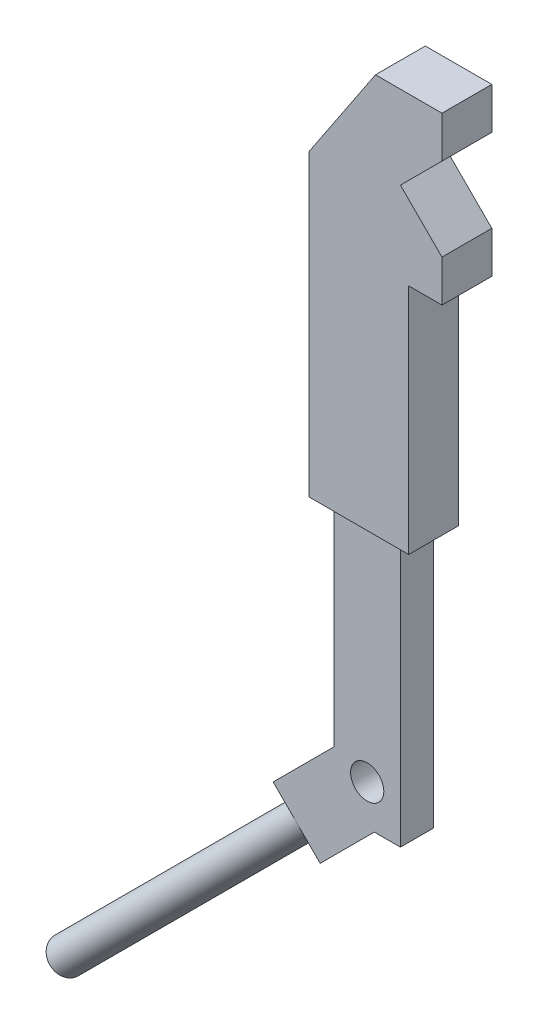
ISO-10303-21;
HEADER;
FILE_DESCRIPTION(('STEP AP214'),'2;1');
FILE_NAME('part.step','',(''),(''),'','','');
FILE_SCHEMA(('AUTOMOTIVE_DESIGN { 1 0 10303 214 1 1 1 1 }'));
ENDSEC;
DATA;
#1=APPLICATION_CONTEXT('core data for automotive mechanical design processes');
#2=APPLICATION_PROTOCOL_DEFINITION('international standard','automotive_design',2000,#1);
#3=PRODUCT_CONTEXT('',#1,'mechanical');
#4=PRODUCT('Part','Part','',(#3));
#5=PRODUCT_RELATED_PRODUCT_CATEGORY('part','',(#4));
#6=PRODUCT_DEFINITION_FORMATION('','',#4);
#7=PRODUCT_DEFINITION_CONTEXT('part definition',#1,'design');
#8=PRODUCT_DEFINITION('design','',#6,#7);
#9=PRODUCT_DEFINITION_SHAPE('','',#8);
#10=(LENGTH_UNIT() NAMED_UNIT(*) SI_UNIT(.MILLI.,.METRE.));
#11=(NAMED_UNIT(*) PLANE_ANGLE_UNIT() SI_UNIT($,.RADIAN.));
#12=(NAMED_UNIT(*) SI_UNIT($,.STERADIAN.) SOLID_ANGLE_UNIT());
#13=UNCERTAINTY_MEASURE_WITH_UNIT(LENGTH_MEASURE(1.E-05),#10,'distance_accuracy_value','');
#14=(GEOMETRIC_REPRESENTATION_CONTEXT(3) GLOBAL_UNCERTAINTY_ASSIGNED_CONTEXT((#13)) GLOBAL_UNIT_ASSIGNED_CONTEXT((#10,
#11,#12)) REPRESENTATION_CONTEXT('',''));
#15=CARTESIAN_POINT('',(0.,0.,0.));
#16=DIRECTION('',(0.,0.,1.));
#17=DIRECTION('',(1.,0.,0.));
#18=AXIS2_PLACEMENT_3D('',#15,#16,#17);
#19=CARTESIAN_POINT('',(-28.284271247462,-2.1421356237308,5.));
#20=DIRECTION('',(0.707106781186551,0.707106781186544,0.));
#21=DIRECTION('',(-0.707106781186544,0.707106781186551,0.));
#22=AXIS2_PLACEMENT_3D('',#19,#20,#21);
#23=PLANE('',#22);
#24=CARTESIAN_POINT('',(-21.2132034355965,-9.21320343559631,0.));
#25=DIRECTION('',(-0.707106781186551,-0.707106781186544,0.));
#26=DIRECTION('',(0.707106781186544,-0.707106781186551,0.));
#27=AXIS2_PLACEMENT_3D('',#24,#25,#26);
#28=CIRCLE('',#27,5.);
#29=CARTESIAN_POINT('',(-21.2132034355965,-9.21320343559631,5.));
#30=VERTEX_POINT('',#29);
#31=CARTESIAN_POINT('',(-21.2132034355965,-9.21320343559631,-5.));
#32=VERTEX_POINT('',#31);
#33=EDGE_CURVE('E43',#30,#32,#28,.T.);
#34=ORIENTED_EDGE('',*,*,#33,.F.);
#35=DIRECTION('',(0.707106781186544,-0.707106781186551,0.));
#36=VECTOR('',#35,1.);
#37=CARTESIAN_POINT('',(-28.284271247462,-2.1421356237308,5.));
#38=LINE('',#37,#36);
#39=CARTESIAN_POINT('',(-28.284271247462,-2.1421356237308,5.));
#40=VERTEX_POINT('',#39);
#41=EDGE_CURVE('E158',#40,#30,#38,.T.);
#42=ORIENTED_EDGE('',*,*,#41,.F.);
#43=DIRECTION('',(0.,0.,-1.));
#44=VECTOR('',#43,1.);
#45=CARTESIAN_POINT('',(-28.284271247462,-2.1421356237308,5.));
#46=LINE('',#45,#44);
#47=CARTESIAN_POINT('',(-28.284271247462,-2.1421356237308,-5.));
#48=VERTEX_POINT('',#47);
#49=EDGE_CURVE('E291',#40,#48,#46,.T.);
#50=ORIENTED_EDGE('',*,*,#49,.T.);
#51=DIRECTION('',(0.707106781186544,-0.707106781186551,0.));
#52=VECTOR('',#51,1.);
#53=CARTESIAN_POINT('',(-28.284271247462,-2.1421356237308,-5.));
#54=LINE('',#53,#52);
#55=EDGE_CURVE('E179',#48,#32,#54,.T.);
#56=ORIENTED_EDGE('',*,*,#55,.T.);
#57=EDGE_LOOP('',(#34,#42,#50,#56));
#58=FACE_BOUND('',#57,.T.);
#59=ADVANCED_FACE('F33',(#58),#23,.F.);
#60=CARTESIAN_POINT('',(-10.,0.,5.));
#61=DIRECTION('',(1.,0.,0.));
#62=DIRECTION('',(0.,0.,-1.));
#63=AXIS2_PLACEMENT_3D('',#60,#61,#62);
#64=PLANE('',#63);
#65=DIRECTION('',(0.,0.,-1.));
#66=VECTOR('',#65,1.);
#67=CARTESIAN_POINT('',(-10.,16.142135623731,5.));
#68=LINE('',#67,#66);
#69=CARTESIAN_POINT('',(-10.,16.142135623731,5.));
#70=VERTEX_POINT('',#69);
#71=CARTESIAN_POINT('',(-10.,16.142135623731,-5.));
#72=VERTEX_POINT('',#71);
#73=EDGE_CURVE('E37',#70,#72,#68,.T.);
#74=ORIENTED_EDGE('',*,*,#73,.F.);
#75=DIRECTION('',(0.,-1.,0.));
#76=VECTOR('',#75,1.);
#77=CARTESIAN_POINT('',(-10.,0.,5.));
#78=LINE('',#77,#76);
#79=CARTESIAN_POINT('',(-10.,80.,5.));
#80=VERTEX_POINT('',#79);
#81=EDGE_CURVE('E372',#80,#70,#78,.T.);
#82=ORIENTED_EDGE('',*,*,#81,.F.);
#83=DIRECTION('',(0.,0.,-1.));
#84=VECTOR('',#83,1.);
#85=CARTESIAN_POINT('',(-10.,80.,5.));
#86=LINE('',#85,#84);
#87=CARTESIAN_POINT('',(-10.,80.,-5.));
#88=VERTEX_POINT('',#87);
#89=EDGE_CURVE('E380',#80,#88,#86,.T.);
#90=ORIENTED_EDGE('',*,*,#89,.T.);
#91=DIRECTION('',(0.,-1.,0.));
#92=VECTOR('',#91,1.);
#93=CARTESIAN_POINT('',(-10.,0.,-5.));
#94=LINE('',#93,#92);
#95=EDGE_CURVE('E369',#88,#72,#94,.T.);
#96=ORIENTED_EDGE('',*,*,#95,.T.);
#97=EDGE_LOOP('',(#74,#82,#90,#96));
#98=FACE_BOUND('',#97,.T.);
#99=ADVANCED_FACE('F35',(#98),#64,.F.);
#100=CARTESIAN_POINT('',(-10.,0.,5.));
#101=DIRECTION('',(0.,1.,0.));
#102=DIRECTION('',(-1.,0.,0.));
#103=AXIS2_PLACEMENT_3D('',#100,#101,#102);
#104=PLANE('',#103);
#105=DIRECTION('',(0.,0.,1.));
#106=VECTOR('',#105,1.);
#107=CARTESIAN_POINT('',(2.1421356237309,0.,5.));
#108=LINE('',#107,#106);
#109=CARTESIAN_POINT('',(2.1421356237309,0.,-5.));
#110=VERTEX_POINT('',#109);
#111=CARTESIAN_POINT('',(2.1421356237309,0.,5.));
#112=VERTEX_POINT('',#111);
#113=EDGE_CURVE('E274',#110,#112,#108,.T.);
#114=ORIENTED_EDGE('',*,*,#113,.F.);
#115=DIRECTION('',(1.,0.,0.));
#116=VECTOR('',#115,1.);
#117=CARTESIAN_POINT('',(-10.,0.,-5.));
#118=LINE('',#117,#116);
#119=CARTESIAN_POINT('',(9.99999999999999,0.,-5.));
#120=VERTEX_POINT('',#119);
#121=EDGE_CURVE('E277',#110,#120,#118,.T.);
#122=ORIENTED_EDGE('',*,*,#121,.T.);
#123=DIRECTION('',(0.,0.,-1.));
#124=VECTOR('',#123,1.);
#125=CARTESIAN_POINT('',(9.99999999999999,0.,5.));
#126=LINE('',#125,#124);
#127=CARTESIAN_POINT('',(9.99999999999999,0.,5.));
#128=VERTEX_POINT('',#127);
#129=EDGE_CURVE('E281',#128,#120,#126,.T.);
#130=ORIENTED_EDGE('',*,*,#129,.F.);
#131=DIRECTION('',(1.,0.,0.));
#132=VECTOR('',#131,1.);
#133=CARTESIAN_POINT('',(-10.,0.,5.));
#134=LINE('',#133,#132);
#135=EDGE_CURVE('E279',#112,#128,#134,.T.);
#136=ORIENTED_EDGE('',*,*,#135,.F.);
#137=EDGE_LOOP('',(#114,#122,#130,#136));
#138=FACE_BOUND('',#137,.T.);
#139=ADVANCED_FACE('F201',(#138),#104,.F.);
#140=CARTESIAN_POINT('',(0.,0.,5.));
#141=DIRECTION('',(0.,0.,-1.));
#142=DIRECTION('',(-1.,0.,0.));
#143=AXIS2_PLACEMENT_3D('',#140,#141,#142);
#144=PLANE('',#143);
#145=ORIENTED_EDGE('',*,*,#81,.T.);
#146=DIRECTION('',(-0.707106781186551,-0.707106781186544,0.));
#147=VECTOR('',#146,1.);
#148=CARTESIAN_POINT('',(-7.07106781186544,19.0710678118655,5.));
#149=LINE('',#148,#147);
#150=EDGE_CURVE('E165',#70,#40,#149,.T.);
#151=ORIENTED_EDGE('',*,*,#150,.T.);
#152=ORIENTED_EDGE('',*,*,#41,.T.);
#153=CARTESIAN_POINT('',(-14.1421356237311,-16.2842712474618,5.));
#154=VERTEX_POINT('',#153);
#155=EDGE_CURVE('E162',#30,#154,#38,.T.);
#156=ORIENTED_EDGE('',*,*,#155,.T.);
#157=DIRECTION('',(0.707106781186551,0.707106781186544,0.));
#158=VECTOR('',#157,1.);
#159=CARTESIAN_POINT('',(7.07106781186544,4.92893218813449,5.));
#160=LINE('',#159,#158);
#161=EDGE_CURVE('E170',#154,#112,#160,.T.);
#162=ORIENTED_EDGE('',*,*,#161,.T.);
#163=ORIENTED_EDGE('',*,*,#135,.T.);
#164=DIRECTION('',(0.,1.,0.));
#165=VECTOR('',#164,1.);
#166=CARTESIAN_POINT('',(9.99999999999999,0.,5.));
#167=LINE('',#166,#165);
#168=CARTESIAN_POINT('',(10.,80.,5.));
#169=VERTEX_POINT('',#168);
#170=EDGE_CURVE('E376',#128,#169,#167,.T.);
#171=ORIENTED_EDGE('',*,*,#170,.T.);
#172=DIRECTION('',(-1.,0.,0.));
#173=VECTOR('',#172,1.);
#174=CARTESIAN_POINT('',(-10.,80.,5.));
#175=LINE('',#174,#173);
#176=EDGE_CURVE('E378',#169,#80,#175,.T.);
#177=ORIENTED_EDGE('',*,*,#176,.T.);
#178=EDGE_LOOP('',(#145,#151,#152,#156,#162,#163,#171,#177));
#179=FACE_BOUND('',#178,.T.);
#180=CARTESIAN_POINT('',(0.,12.,5.));
#181=DIRECTION('',(0.,0.,1.));
#182=DIRECTION('',(1.,0.,0.));
#183=AXIS2_PLACEMENT_3D('',#180,#181,#182);
#184=CIRCLE('',#183,5.);
#185=CARTESIAN_POINT('',(5.,12.,5.));
#186=VERTEX_POINT('',#185);
#187=EDGE_CURVE('E366',#186,#186,#184,.T.);
#188=ORIENTED_EDGE('',*,*,#187,.F.);
#189=EDGE_LOOP('',(#188));
#190=FACE_BOUND('',#189,.T.);
#191=ADVANCED_FACE('F159',(#179,#190),#144,.F.);
#192=CARTESIAN_POINT('',(0.,0.,-5.));
#193=DIRECTION('',(0.,0.,-1.));
#194=DIRECTION('',(-1.,0.,0.));
#195=AXIS2_PLACEMENT_3D('',#192,#193,#194);
#196=PLANE('',#195);
#197=DIRECTION('',(-0.707106781186551,-0.707106781186544,0.));
#198=VECTOR('',#197,1.);
#199=CARTESIAN_POINT('',(-7.07106781186544,19.0710678118655,-5.));
#200=LINE('',#199,#198);
#201=EDGE_CURVE('E401',#72,#48,#200,.T.);
#202=ORIENTED_EDGE('',*,*,#201,.F.);
#203=ORIENTED_EDGE('',*,*,#95,.F.);
#204=DIRECTION('',(-1.,0.,0.));
#205=VECTOR('',#204,1.);
#206=CARTESIAN_POINT('',(-10.,80.,-5.));
#207=LINE('',#206,#205);
#208=CARTESIAN_POINT('',(10.,80.,-5.));
#209=VERTEX_POINT('',#208);
#210=EDGE_CURVE('E374',#209,#88,#207,.T.);
#211=ORIENTED_EDGE('',*,*,#210,.F.);
#212=DIRECTION('',(0.,1.,0.));
#213=VECTOR('',#212,1.);
#214=CARTESIAN_POINT('',(9.99999999999999,0.,-5.));
#215=LINE('',#214,#213);
#216=EDGE_CURVE('E383',#120,#209,#215,.T.);
#217=ORIENTED_EDGE('',*,*,#216,.F.);
#218=ORIENTED_EDGE('',*,*,#121,.F.);
#219=DIRECTION('',(0.707106781186551,0.707106781186544,0.));
#220=VECTOR('',#219,1.);
#221=CARTESIAN_POINT('',(7.07106781186544,4.92893218813449,-5.));
#222=LINE('',#221,#220);
#223=CARTESIAN_POINT('',(-14.1421356237311,-16.2842712474618,-5.));
#224=VERTEX_POINT('',#223);
#225=EDGE_CURVE('E283',#224,#110,#222,.T.);
#226=ORIENTED_EDGE('',*,*,#225,.F.);
#227=EDGE_CURVE('E286',#32,#224,#54,.T.);
#228=ORIENTED_EDGE('',*,*,#227,.F.);
#229=ORIENTED_EDGE('',*,*,#55,.F.);
#230=EDGE_LOOP('',(#202,#203,#211,#217,#218,#226,#228,#229));
#231=FACE_BOUND('',#230,.T.);
#232=CARTESIAN_POINT('',(0.,12.,-5.));
#233=DIRECTION('',(0.,0.,1.));
#234=DIRECTION('',(1.,0.,0.));
#235=AXIS2_PLACEMENT_3D('',#232,#233,#234);
#236=CIRCLE('',#235,5.);
#237=CARTESIAN_POINT('',(5.,12.,-5.));
#238=VERTEX_POINT('',#237);
#239=EDGE_CURVE('E365',#238,#238,#236,.T.);
#240=ORIENTED_EDGE('',*,*,#239,.T.);
#241=EDGE_LOOP('',(#240));
#242=FACE_BOUND('',#241,.T.);
#243=ADVANCED_FACE('F262',(#231,#242),#196,.T.);
#244=CARTESIAN_POINT('',(9.99999999999999,0.,5.));
#245=DIRECTION('',(-1.,0.,0.));
#246=DIRECTION('',(0.,-1.,0.));
#247=AXIS2_PLACEMENT_3D('',#244,#245,#246);
#248=PLANE('',#247);
#249=ORIENTED_EDGE('',*,*,#216,.T.);
#250=DIRECTION('',(0.,0.,-1.));
#251=VECTOR('',#250,1.);
#252=CARTESIAN_POINT('',(10.,80.,5.));
#253=LINE('',#252,#251);
#254=EDGE_CURVE('E389',#169,#209,#253,.T.);
#255=ORIENTED_EDGE('',*,*,#254,.F.);
#256=ORIENTED_EDGE('',*,*,#170,.F.);
#257=ORIENTED_EDGE('',*,*,#129,.T.);
#258=EDGE_LOOP('',(#249,#255,#256,#257));
#259=FACE_BOUND('',#258,.T.);
#260=ADVANCED_FACE('F258',(#259),#248,.F.);
#261=CARTESIAN_POINT('',(0.,12.,5.));
#262=DIRECTION('',(0.,0.,-1.));
#263=DIRECTION('',(-1.,0.,0.));
#264=AXIS2_PLACEMENT_3D('',#261,#262,#263);
#265=CYLINDRICAL_SURFACE('',#264,5.);
#266=ORIENTED_EDGE('',*,*,#239,.F.);
#267=EDGE_LOOP('',(#266));
#268=FACE_BOUND('',#267,.T.);
#269=ORIENTED_EDGE('',*,*,#187,.T.);
#270=EDGE_LOOP('',(#269));
#271=FACE_BOUND('',#270,.T.);
#272=ADVANCED_FACE('F254',(#268,#271),#265,.F.);
#273=CARTESIAN_POINT('',(15.,80.,7.5));
#274=DIRECTION('',(0.,1.,0.));
#275=DIRECTION('',(0.,0.,1.));
#276=AXIS2_PLACEMENT_3D('',#273,#274,#275);
#277=PLANE('',#276);
#278=DIRECTION('',(1.,0.,0.));
#279=VECTOR('',#278,1.);
#280=CARTESIAN_POINT('',(15.,80.,-7.5));
#281=LINE('',#280,#279);
#282=CARTESIAN_POINT('',(-15.,80.,-7.5));
#283=VERTEX_POINT('',#282);
#284=CARTESIAN_POINT('',(15.,80.,-7.5));
#285=VERTEX_POINT('',#284);
#286=EDGE_CURVE('E293',#283,#285,#281,.T.);
#287=ORIENTED_EDGE('',*,*,#286,.T.);
#288=DIRECTION('',(0.,0.,-1.));
#289=VECTOR('',#288,1.);
#290=CARTESIAN_POINT('',(15.,80.,7.5));
#291=LINE('',#290,#289);
#292=CARTESIAN_POINT('',(15.,80.,7.5));
#293=VERTEX_POINT('',#292);
#294=EDGE_CURVE('E362',#293,#285,#291,.T.);
#295=ORIENTED_EDGE('',*,*,#294,.F.);
#296=DIRECTION('',(1.,0.,0.));
#297=VECTOR('',#296,1.);
#298=CARTESIAN_POINT('',(15.,80.,7.5));
#299=LINE('',#298,#297);
#300=CARTESIAN_POINT('',(-15.,80.,7.5));
#301=VERTEX_POINT('',#300);
#302=EDGE_CURVE('E294',#301,#293,#299,.T.);
#303=ORIENTED_EDGE('',*,*,#302,.F.);
#304=DIRECTION('',(0.,0.,-1.));
#305=VECTOR('',#304,1.);
#306=CARTESIAN_POINT('',(-15.,80.,7.5));
#307=LINE('',#306,#305);
#308=EDGE_CURVE('E316',#301,#283,#307,.T.);
#309=ORIENTED_EDGE('',*,*,#308,.T.);
#310=EDGE_LOOP('',(#287,#295,#303,#309));
#311=FACE_BOUND('',#310,.T.);
#312=ORIENTED_EDGE('',*,*,#254,.T.);
#313=ORIENTED_EDGE('',*,*,#210,.T.);
#314=ORIENTED_EDGE('',*,*,#89,.F.);
#315=ORIENTED_EDGE('',*,*,#176,.F.);
#316=EDGE_LOOP('',(#312,#313,#314,#315));
#317=FACE_BOUND('',#316,.T.);
#318=ADVANCED_FACE('F250',(#311,#317),#277,.F.);
#319=CARTESIAN_POINT('',(15.,150.,7.5));
#320=DIRECTION('',(-1.,0.,0.));
#321=DIRECTION('',(0.,0.,1.));
#322=AXIS2_PLACEMENT_3D('',#319,#320,#321);
#323=PLANE('',#322);
#324=DIRECTION('',(0.,1.,0.));
#325=VECTOR('',#324,1.);
#326=CARTESIAN_POINT('',(15.,150.,-7.5));
#327=LINE('',#326,#325);
#328=CARTESIAN_POINT('',(15.,150.,-7.5));
#329=VERTEX_POINT('',#328);
#330=EDGE_CURVE('E319',#285,#329,#327,.T.);
#331=ORIENTED_EDGE('',*,*,#330,.T.);
#332=DIRECTION('',(0.,0.,-1.));
#333=VECTOR('',#332,1.);
#334=CARTESIAN_POINT('',(15.,150.,7.5));
#335=LINE('',#334,#333);
#336=CARTESIAN_POINT('',(15.,150.,7.5));
#337=VERTEX_POINT('',#336);
#338=EDGE_CURVE('E359',#337,#329,#335,.T.);
#339=ORIENTED_EDGE('',*,*,#338,.F.);
#340=DIRECTION('',(0.,1.,0.));
#341=VECTOR('',#340,1.);
#342=CARTESIAN_POINT('',(15.,150.,7.5));
#343=LINE('',#342,#341);
#344=EDGE_CURVE('E297',#293,#337,#343,.T.);
#345=ORIENTED_EDGE('',*,*,#344,.F.);
#346=ORIENTED_EDGE('',*,*,#294,.T.);
#347=EDGE_LOOP('',(#331,#339,#345,#346));
#348=FACE_BOUND('',#347,.T.);
#349=ADVANCED_FACE('F246',(#348),#323,.F.);
#350=CARTESIAN_POINT('',(25.,150.,7.5));
#351=DIRECTION('',(0.,1.,0.));
#352=DIRECTION('',(0.,0.,1.));
#353=AXIS2_PLACEMENT_3D('',#350,#351,#352);
#354=PLANE('',#353);
#355=DIRECTION('',(1.,0.,0.));
#356=VECTOR('',#355,1.);
#357=CARTESIAN_POINT('',(25.,150.,-7.5));
#358=LINE('',#357,#356);
#359=CARTESIAN_POINT('',(25.,150.,-7.5));
#360=VERTEX_POINT('',#359);
#361=EDGE_CURVE('E321',#329,#360,#358,.T.);
#362=ORIENTED_EDGE('',*,*,#361,.T.);
#363=DIRECTION('',(0.,0.,-1.));
#364=VECTOR('',#363,1.);
#365=CARTESIAN_POINT('',(25.,150.,7.5));
#366=LINE('',#365,#364);
#367=CARTESIAN_POINT('',(25.,150.,7.5));
#368=VERTEX_POINT('',#367);
#369=EDGE_CURVE('E356',#368,#360,#366,.T.);
#370=ORIENTED_EDGE('',*,*,#369,.F.);
#371=DIRECTION('',(1.,0.,0.));
#372=VECTOR('',#371,1.);
#373=CARTESIAN_POINT('',(25.,150.,7.5));
#374=LINE('',#373,#372);
#375=EDGE_CURVE('E300',#337,#368,#374,.T.);
#376=ORIENTED_EDGE('',*,*,#375,.F.);
#377=ORIENTED_EDGE('',*,*,#338,.T.);
#378=EDGE_LOOP('',(#362,#370,#376,#377));
#379=FACE_BOUND('',#378,.T.);
#380=ADVANCED_FACE('F242',(#379),#354,.F.);
#381=CARTESIAN_POINT('',(25.,162.5,7.5));
#382=DIRECTION('',(-1.,0.,0.));
#383=DIRECTION('',(0.,0.,1.));
#384=AXIS2_PLACEMENT_3D('',#381,#382,#383);
#385=PLANE('',#384);
#386=DIRECTION('',(0.,1.,0.));
#387=VECTOR('',#386,1.);
#388=CARTESIAN_POINT('',(25.,162.5,-7.5));
#389=LINE('',#388,#387);
#390=CARTESIAN_POINT('',(25.,162.5,-7.5));
#391=VERTEX_POINT('',#390);
#392=EDGE_CURVE('E323',#360,#391,#389,.T.);
#393=ORIENTED_EDGE('',*,*,#392,.T.);
#394=DIRECTION('',(0.,0.,-1.));
#395=VECTOR('',#394,1.);
#396=CARTESIAN_POINT('',(25.,162.5,7.5));
#397=LINE('',#396,#395);
#398=CARTESIAN_POINT('',(25.,162.5,7.5));
#399=VERTEX_POINT('',#398);
#400=EDGE_CURVE('E353',#399,#391,#397,.T.);
#401=ORIENTED_EDGE('',*,*,#400,.F.);
#402=DIRECTION('',(0.,1.,0.));
#403=VECTOR('',#402,1.);
#404=CARTESIAN_POINT('',(25.,162.5,7.5));
#405=LINE('',#404,#403);
#406=EDGE_CURVE('E302',#368,#399,#405,.T.);
#407=ORIENTED_EDGE('',*,*,#406,.F.);
#408=ORIENTED_EDGE('',*,*,#369,.T.);
#409=EDGE_LOOP('',(#393,#401,#407,#408));
#410=FACE_BOUND('',#409,.T.);
#411=ADVANCED_FACE('F238',(#410),#385,.F.);
#412=CARTESIAN_POINT('',(12.5,175.,7.5));
#413=DIRECTION('',(-0.707106781186548,-0.707106781186547,0.));
#414=DIRECTION('',(0.707106781186547,-0.707106781186548,0.));
#415=AXIS2_PLACEMENT_3D('',#412,#413,#414);
#416=PLANE('',#415);
#417=DIRECTION('',(-0.707106781186547,0.707106781186548,0.));
#418=VECTOR('',#417,1.);
#419=CARTESIAN_POINT('',(12.5,175.,-7.5));
#420=LINE('',#419,#418);
#421=CARTESIAN_POINT('',(12.5,175.,-7.5));
#422=VERTEX_POINT('',#421);
#423=EDGE_CURVE('E325',#391,#422,#420,.T.);
#424=ORIENTED_EDGE('',*,*,#423,.T.);
#425=DIRECTION('',(0.,0.,-1.));
#426=VECTOR('',#425,1.);
#427=CARTESIAN_POINT('',(12.5,175.,7.5));
#428=LINE('',#427,#426);
#429=CARTESIAN_POINT('',(12.5,175.,7.5));
#430=VERTEX_POINT('',#429);
#431=EDGE_CURVE('E350',#430,#422,#428,.T.);
#432=ORIENTED_EDGE('',*,*,#431,.F.);
#433=DIRECTION('',(-0.707106781186547,0.707106781186548,0.));
#434=VECTOR('',#433,1.);
#435=CARTESIAN_POINT('',(12.5,175.,7.5));
#436=LINE('',#435,#434);
#437=EDGE_CURVE('E304',#399,#430,#436,.T.);
#438=ORIENTED_EDGE('',*,*,#437,.F.);
#439=ORIENTED_EDGE('',*,*,#400,.T.);
#440=EDGE_LOOP('',(#424,#432,#438,#439));
#441=FACE_BOUND('',#440,.T.);
#442=ADVANCED_FACE('F234',(#441),#416,.F.);
#443=CARTESIAN_POINT('',(25.,187.5,7.5));
#444=DIRECTION('',(-0.707106781186548,0.707106781186547,0.));
#445=DIRECTION('',(-0.707106781186547,-0.707106781186548,0.));
#446=AXIS2_PLACEMENT_3D('',#443,#444,#445);
#447=PLANE('',#446);
#448=DIRECTION('',(0.707106781186547,0.707106781186548,0.));
#449=VECTOR('',#448,1.);
#450=CARTESIAN_POINT('',(25.,187.5,-7.5));
#451=LINE('',#450,#449);
#452=CARTESIAN_POINT('',(25.,187.5,-7.5));
#453=VERTEX_POINT('',#452);
#454=EDGE_CURVE('E327',#422,#453,#451,.T.);
#455=ORIENTED_EDGE('',*,*,#454,.T.);
#456=DIRECTION('',(0.,0.,-1.));
#457=VECTOR('',#456,1.);
#458=CARTESIAN_POINT('',(25.,187.5,7.5));
#459=LINE('',#458,#457);
#460=CARTESIAN_POINT('',(25.,187.5,7.5));
#461=VERTEX_POINT('',#460);
#462=EDGE_CURVE('E347',#461,#453,#459,.T.);
#463=ORIENTED_EDGE('',*,*,#462,.F.);
#464=DIRECTION('',(0.707106781186547,0.707106781186548,0.));
#465=VECTOR('',#464,1.);
#466=CARTESIAN_POINT('',(25.,187.5,7.5));
#467=LINE('',#466,#465);
#468=EDGE_CURVE('E306',#430,#461,#467,.T.);
#469=ORIENTED_EDGE('',*,*,#468,.F.);
#470=ORIENTED_EDGE('',*,*,#431,.T.);
#471=EDGE_LOOP('',(#455,#463,#469,#470));
#472=FACE_BOUND('',#471,.T.);
#473=ADVANCED_FACE('F230',(#472),#447,.F.);
#474=CARTESIAN_POINT('',(25.,200.,7.5));
#475=DIRECTION('',(-1.,0.,0.));
#476=DIRECTION('',(0.,0.,1.));
#477=AXIS2_PLACEMENT_3D('',#474,#475,#476);
#478=PLANE('',#477);
#479=DIRECTION('',(0.,1.,0.));
#480=VECTOR('',#479,1.);
#481=CARTESIAN_POINT('',(25.,200.,-7.5));
#482=LINE('',#481,#480);
#483=CARTESIAN_POINT('',(25.,200.,-7.5));
#484=VERTEX_POINT('',#483);
#485=EDGE_CURVE('E329',#453,#484,#482,.T.);
#486=ORIENTED_EDGE('',*,*,#485,.T.);
#487=DIRECTION('',(0.,0.,-1.));
#488=VECTOR('',#487,1.);
#489=CARTESIAN_POINT('',(25.,200.,7.5));
#490=LINE('',#489,#488);
#491=CARTESIAN_POINT('',(25.,200.,7.5));
#492=VERTEX_POINT('',#491);
#493=EDGE_CURVE('E344',#492,#484,#490,.T.);
#494=ORIENTED_EDGE('',*,*,#493,.F.);
#495=DIRECTION('',(0.,1.,0.));
#496=VECTOR('',#495,1.);
#497=CARTESIAN_POINT('',(25.,200.,7.5));
#498=LINE('',#497,#496);
#499=EDGE_CURVE('E308',#461,#492,#498,.T.);
#500=ORIENTED_EDGE('',*,*,#499,.F.);
#501=ORIENTED_EDGE('',*,*,#462,.T.);
#502=EDGE_LOOP('',(#486,#494,#500,#501));
#503=FACE_BOUND('',#502,.T.);
#504=ADVANCED_FACE('F226',(#503),#478,.F.);
#505=CARTESIAN_POINT('',(5.,200.,7.5));
#506=DIRECTION('',(0.,-1.,0.));
#507=DIRECTION('',(0.,0.,-1.));
#508=AXIS2_PLACEMENT_3D('',#505,#506,#507);
#509=PLANE('',#508);
#510=DIRECTION('',(-1.,0.,0.));
#511=VECTOR('',#510,1.);
#512=CARTESIAN_POINT('',(5.,200.,-7.5));
#513=LINE('',#512,#511);
#514=CARTESIAN_POINT('',(5.,200.,-7.5));
#515=VERTEX_POINT('',#514);
#516=EDGE_CURVE('E331',#484,#515,#513,.T.);
#517=ORIENTED_EDGE('',*,*,#516,.T.);
#518=DIRECTION('',(0.,0.,-1.));
#519=VECTOR('',#518,1.);
#520=CARTESIAN_POINT('',(5.,200.,7.5));
#521=LINE('',#520,#519);
#522=CARTESIAN_POINT('',(5.,200.,7.5));
#523=VERTEX_POINT('',#522);
#524=EDGE_CURVE('E341',#523,#515,#521,.T.);
#525=ORIENTED_EDGE('',*,*,#524,.F.);
#526=DIRECTION('',(-1.,0.,0.));
#527=VECTOR('',#526,1.);
#528=CARTESIAN_POINT('',(5.,200.,7.5));
#529=LINE('',#528,#527);
#530=EDGE_CURVE('E310',#492,#523,#529,.T.);
#531=ORIENTED_EDGE('',*,*,#530,.F.);
#532=ORIENTED_EDGE('',*,*,#493,.T.);
#533=EDGE_LOOP('',(#517,#525,#531,#532));
#534=FACE_BOUND('',#533,.T.);
#535=ADVANCED_FACE('F222',(#534),#509,.F.);
#536=CARTESIAN_POINT('',(-15.,170.,7.5));
#537=DIRECTION('',(0.832050294337844,-0.554700196225229,0.));
#538=DIRECTION('',(0.554700196225229,0.832050294337844,0.));
#539=AXIS2_PLACEMENT_3D('',#536,#537,#538);
#540=PLANE('',#539);
#541=DIRECTION('',(-0.554700196225229,-0.832050294337844,0.));
#542=VECTOR('',#541,1.);
#543=CARTESIAN_POINT('',(-15.,170.,-7.5));
#544=LINE('',#543,#542);
#545=CARTESIAN_POINT('',(-15.,170.,-7.5));
#546=VERTEX_POINT('',#545);
#547=EDGE_CURVE('E333',#515,#546,#544,.T.);
#548=ORIENTED_EDGE('',*,*,#547,.T.);
#549=DIRECTION('',(0.,0.,-1.));
#550=VECTOR('',#549,1.);
#551=CARTESIAN_POINT('',(-15.,170.,7.5));
#552=LINE('',#551,#550);
#553=CARTESIAN_POINT('',(-15.,170.,7.5));
#554=VERTEX_POINT('',#553);
#555=EDGE_CURVE('E338',#554,#546,#552,.T.);
#556=ORIENTED_EDGE('',*,*,#555,.F.);
#557=DIRECTION('',(-0.554700196225229,-0.832050294337844,0.));
#558=VECTOR('',#557,1.);
#559=CARTESIAN_POINT('',(-15.,170.,7.5));
#560=LINE('',#559,#558);
#561=EDGE_CURVE('E312',#523,#554,#560,.T.);
#562=ORIENTED_EDGE('',*,*,#561,.F.);
#563=ORIENTED_EDGE('',*,*,#524,.T.);
#564=EDGE_LOOP('',(#548,#556,#562,#563));
#565=FACE_BOUND('',#564,.T.);
#566=ADVANCED_FACE('F218',(#565),#540,.F.);
#567=CARTESIAN_POINT('',(-15.,80.,7.5));
#568=DIRECTION('',(1.,0.,0.));
#569=DIRECTION('',(0.,0.,-1.));
#570=AXIS2_PLACEMENT_3D('',#567,#568,#569);
#571=PLANE('',#570);
#572=DIRECTION('',(0.,-1.,0.));
#573=VECTOR('',#572,1.);
#574=CARTESIAN_POINT('',(-15.,80.,-7.5));
#575=LINE('',#574,#573);
#576=EDGE_CURVE('E298',#546,#283,#575,.T.);
#577=ORIENTED_EDGE('',*,*,#576,.T.);
#578=ORIENTED_EDGE('',*,*,#308,.F.);
#579=DIRECTION('',(0.,-1.,0.));
#580=VECTOR('',#579,1.);
#581=CARTESIAN_POINT('',(-15.,80.,7.5));
#582=LINE('',#581,#580);
#583=EDGE_CURVE('E314',#554,#301,#582,.T.);
#584=ORIENTED_EDGE('',*,*,#583,.F.);
#585=ORIENTED_EDGE('',*,*,#555,.T.);
#586=EDGE_LOOP('',(#577,#578,#584,#585));
#587=FACE_BOUND('',#586,.T.);
#588=ADVANCED_FACE('F211',(#587),#571,.F.);
#589=CARTESIAN_POINT('',(0.,0.,7.5));
#590=DIRECTION('',(0.,0.,-1.));
#591=DIRECTION('',(-1.,0.,0.));
#592=AXIS2_PLACEMENT_3D('',#589,#590,#591);
#593=PLANE('',#592);
#594=ORIENTED_EDGE('',*,*,#302,.T.);
#595=ORIENTED_EDGE('',*,*,#344,.T.);
#596=ORIENTED_EDGE('',*,*,#375,.T.);
#597=ORIENTED_EDGE('',*,*,#406,.T.);
#598=ORIENTED_EDGE('',*,*,#437,.T.);
#599=ORIENTED_EDGE('',*,*,#468,.T.);
#600=ORIENTED_EDGE('',*,*,#499,.T.);
#601=ORIENTED_EDGE('',*,*,#530,.T.);
#602=ORIENTED_EDGE('',*,*,#561,.T.);
#603=ORIENTED_EDGE('',*,*,#583,.T.);
#604=EDGE_LOOP('',(#594,#595,#596,#597,#598,#599,#600,#601,#602,#603));
#605=FACE_BOUND('',#604,.T.);
#606=ADVANCED_FACE('F208',(#605),#593,.F.);
#607=CARTESIAN_POINT('',(0.,0.,-7.5));
#608=DIRECTION('',(0.,0.,-1.));
#609=DIRECTION('',(-1.,0.,0.));
#610=AXIS2_PLACEMENT_3D('',#607,#608,#609);
#611=PLANE('',#610);
#612=ORIENTED_EDGE('',*,*,#286,.F.);
#613=ORIENTED_EDGE('',*,*,#576,.F.);
#614=ORIENTED_EDGE('',*,*,#547,.F.);
#615=ORIENTED_EDGE('',*,*,#516,.F.);
#616=ORIENTED_EDGE('',*,*,#485,.F.);
#617=ORIENTED_EDGE('',*,*,#454,.F.);
#618=ORIENTED_EDGE('',*,*,#423,.F.);
#619=ORIENTED_EDGE('',*,*,#392,.F.);
#620=ORIENTED_EDGE('',*,*,#361,.F.);
#621=ORIENTED_EDGE('',*,*,#330,.F.);
#622=EDGE_LOOP('',(#612,#613,#614,#615,#616,#617,#618,#619,#620,#621));
#623=FACE_BOUND('',#622,.T.);
#624=ADVANCED_FACE('F206',(#623),#611,.T.);
#625=CARTESIAN_POINT('',(-7.07106781186544,19.0710678118655,5.));
#626=DIRECTION('',(0.707106781186544,-0.707106781186551,0.));
#627=DIRECTION('',(0.707106781186551,0.707106781186544,0.));
#628=AXIS2_PLACEMENT_3D('',#625,#626,#627);
#629=PLANE('',#628);
#630=ORIENTED_EDGE('',*,*,#150,.F.);
#631=ORIENTED_EDGE('',*,*,#73,.T.);
#632=ORIENTED_EDGE('',*,*,#201,.T.);
#633=ORIENTED_EDGE('',*,*,#49,.F.);
#634=EDGE_LOOP('',(#630,#631,#632,#633));
#635=FACE_BOUND('',#634,.T.);
#636=ADVANCED_FACE('F203',(#635),#629,.F.);
#637=CARTESIAN_POINT('',(7.07106781186544,4.92893218813449,5.));
#638=DIRECTION('',(-0.707106781186544,0.707106781186551,0.));
#639=DIRECTION('',(-0.707106781186551,-0.707106781186544,0.));
#640=AXIS2_PLACEMENT_3D('',#637,#638,#639);
#641=PLANE('',#640);
#642=ORIENTED_EDGE('',*,*,#225,.T.);
#643=ORIENTED_EDGE('',*,*,#113,.T.);
#644=ORIENTED_EDGE('',*,*,#161,.F.);
#645=DIRECTION('',(0.,0.,-1.));
#646=VECTOR('',#645,1.);
#647=CARTESIAN_POINT('',(-14.1421356237311,-16.2842712474618,5.));
#648=LINE('',#647,#646);
#649=EDGE_CURVE('E174',#154,#224,#648,.T.);
#650=ORIENTED_EDGE('',*,*,#649,.T.);
#651=EDGE_LOOP('',(#642,#643,#644,#650));
#652=FACE_BOUND('',#651,.T.);
#653=ADVANCED_FACE('F193',(#652),#641,.F.);
#654=EDGE_CURVE('E11',#32,#30,#28,.T.);
#655=ORIENTED_EDGE('',*,*,#654,.F.);
#656=ORIENTED_EDGE('',*,*,#227,.T.);
#657=ORIENTED_EDGE('',*,*,#649,.F.);
#658=ORIENTED_EDGE('',*,*,#155,.F.);
#659=EDGE_LOOP('',(#655,#656,#657,#658));
#660=FACE_BOUND('',#659,.T.);
#661=ADVANCED_FACE('F172',(#660),#23,.F.);
#662=CARTESIAN_POINT('',(-95.4594154601844,-83.4594154601834,0.));
#663=DIRECTION('',(0.707106781186551,0.707106781186544,0.));
#664=DIRECTION('',(-0.707106781186544,0.707106781186551,0.));
#665=AXIS2_PLACEMENT_3D('',#662,#663,#664);
#666=CYLINDRICAL_SURFACE('',#665,5.);
#667=CARTESIAN_POINT('',(-95.4594154601844,-83.4594154601834,0.));
#668=DIRECTION('',(-0.707106781186551,-0.707106781186544,0.));
#669=DIRECTION('',(0.707106781186544,-0.707106781186551,0.));
#670=AXIS2_PLACEMENT_3D('',#667,#668,#669);
#671=CIRCLE('',#670,5.);
#672=CARTESIAN_POINT('',(-91.9238815542517,-86.9949493661162,0.));
#673=VERTEX_POINT('',#672);
#674=EDGE_CURVE('E181',#673,#673,#671,.T.);
#675=ORIENTED_EDGE('',*,*,#674,.F.);
#676=EDGE_LOOP('',(#675));
#677=FACE_BOUND('',#676,.T.);
#678=ORIENTED_EDGE('',*,*,#33,.T.);
#679=ORIENTED_EDGE('',*,*,#654,.T.);
#680=EDGE_LOOP('',(#678,#679));
#681=FACE_BOUND('',#680,.T.);
#682=ADVANCED_FACE('F182',(#677,#681),#666,.T.);
#683=CARTESIAN_POINT('',(-95.4594154601844,-83.4594154601834,0.));
#684=DIRECTION('',(-0.707106781186551,-0.707106781186544,0.));
#685=DIRECTION('',(0.707106781186544,-0.707106781186551,0.));
#686=AXIS2_PLACEMENT_3D('',#683,#684,#685);
#687=PLANE('',#686);
#688=ORIENTED_EDGE('',*,*,#674,.T.);
#689=EDGE_LOOP('',(#688));
#690=FACE_BOUND('',#689,.T.);
#691=ADVANCED_FACE('F184',(#690),#687,.T.);
#692=CLOSED_SHELL('',(#59,#99,#139,#191,#243,#260,#272,#318,#349,#380,#411,#442,#473,#504,#535,
#566,#588,#606,#624,#636,#653,#661,#682,#691));
#693=MANIFOLD_SOLID_BREP('B2',#692);
#694=ADVANCED_BREP_SHAPE_REPRESENTATION('',(#18,#693),#14);
#695=SHAPE_DEFINITION_REPRESENTATION(#9,#694);
ENDSEC;
END-ISO-10303-21;
